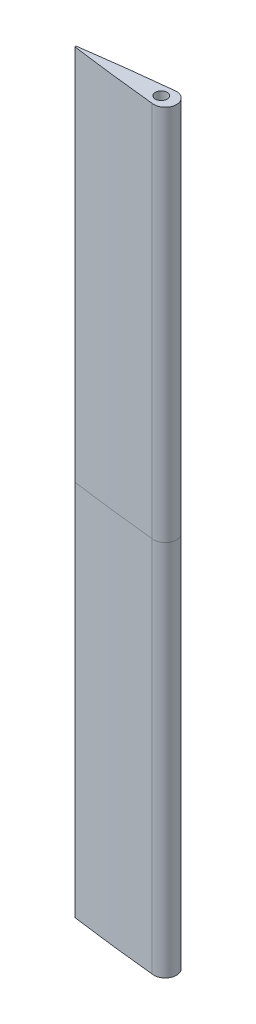
ISO-10303-21;
HEADER;
FILE_DESCRIPTION(('STEP AP214'),'2;1');
FILE_NAME('part.step','',(''),(''),'','','');
FILE_SCHEMA(('AUTOMOTIVE_DESIGN { 1 0 10303 214 1 1 1 1 }'));
ENDSEC;
DATA;
#1=APPLICATION_CONTEXT('core data for automotive mechanical design processes');
#2=APPLICATION_PROTOCOL_DEFINITION('international standard','automotive_design',2000,#1);
#3=PRODUCT_CONTEXT('',#1,'mechanical');
#4=PRODUCT('Part','Part','',(#3));
#5=PRODUCT_RELATED_PRODUCT_CATEGORY('part','',(#4));
#6=PRODUCT_DEFINITION_FORMATION('','',#4);
#7=PRODUCT_DEFINITION_CONTEXT('part definition',#1,'design');
#8=PRODUCT_DEFINITION('design','',#6,#7);
#9=PRODUCT_DEFINITION_SHAPE('','',#8);
#10=(LENGTH_UNIT() NAMED_UNIT(*) SI_UNIT(.MILLI.,.METRE.));
#11=(NAMED_UNIT(*) PLANE_ANGLE_UNIT() SI_UNIT($,.RADIAN.));
#12=(NAMED_UNIT(*) SI_UNIT($,.STERADIAN.) SOLID_ANGLE_UNIT());
#13=UNCERTAINTY_MEASURE_WITH_UNIT(LENGTH_MEASURE(1.E-05),#10,'distance_accuracy_value','');
#14=(GEOMETRIC_REPRESENTATION_CONTEXT(3) GLOBAL_UNCERTAINTY_ASSIGNED_CONTEXT((#13)) GLOBAL_UNIT_ASSIGNED_CONTEXT((#10,
#11,#12)) REPRESENTATION_CONTEXT('',''));
#15=CARTESIAN_POINT('',(0.,0.,0.));
#16=DIRECTION('',(0.,0.,1.));
#17=DIRECTION('',(1.,0.,0.));
#18=AXIS2_PLACEMENT_3D('',#15,#16,#17);
#19=CARTESIAN_POINT('',(0.,190.,0.));
#20=DIRECTION('',(0.,1.,0.));
#21=DIRECTION('',(0.,0.,1.));
#22=AXIS2_PLACEMENT_3D('',#19,#20,#21);
#23=PLANE('',#22);
#24=DIRECTION('',(7.0098962931437E-07,0.,0.999999999999754));
#25=VECTOR('',#24,1.);
#26=CARTESIAN_POINT('',(-9.09780797356294,190.,-0.883777471889075));
#27=LINE('',#26,#25);
#28=CARTESIAN_POINT('',(-9.09780797127802,190.,-0.883777472212133));
#29=VERTEX_POINT('',#28);
#30=CARTESIAN_POINT('',(-9.09780754001095,190.,-0.265291879737339));
#31=VERTEX_POINT('',#30);
#32=EDGE_CURVE('E104',#29,#31,#27,.T.);
#33=ORIENTED_EDGE('',*,*,#32,.T.);
#34=CARTESIAN_POINT('',(961636.924313305,190.,-273912.438107476));
#35=CARTESIAN_POINT('',(-964958.65464866,190.,263071.185208628));
#36=CARTESIAN_POINT('',(967448.922188831,190.,-252605.936221571));
#37=B_SPLINE_CURVE_WITH_KNOTS('',2,(#34,#35,#36),.UNSPECIFIED.,.F.,.F.,(3,3),(0.,1.),.UNSPECIFIED.);
#38=CARTESIAN_POINT('',(35.0713490991894,190.,4.93965416649326));
#39=VERTEX_POINT('',#38);
#40=EDGE_CURVE('E113',#31,#39,#37,.T.);
#41=ORIENTED_EDGE('',*,*,#40,.T.);
#42=CARTESIAN_POINT('',(36.0713490991894,190.,-0.686445363234236));
#43=DIRECTION('',(0.,1.,0.));
#44=DIRECTION('',(0.,0.,1.));
#45=AXIS2_PLACEMENT_3D('',#42,#43,#44);
#46=CIRCLE('',#45,5.71428);
#47=CARTESIAN_POINT('',(35.0713490991895,190.,-6.31254489296174));
#48=VERTEX_POINT('',#47);
#49=EDGE_CURVE('E118',#39,#48,#46,.T.);
#50=ORIENTED_EDGE('',*,*,#49,.T.);
#51=CARTESIAN_POINT('',(968735.08533982,190.,247625.104847928));
#52=CARTESIAN_POINT('',(-966297.159558536,190.,-258114.314813913));
#53=CARTESIAN_POINT('',(963027.584456695,190.,268979.776906749));
#54=B_SPLINE_CURVE_WITH_KNOTS('',2,(#51,#52,#53),.UNSPECIFIED.,.F.,.F.,(3,3),(0.,1.),.UNSPECIFIED.);
#55=EDGE_CURVE('E122',#48,#29,#54,.T.);
#56=ORIENTED_EDGE('',*,*,#55,.T.);
#57=EDGE_LOOP('',(#33,#41,#50,#56));
#58=FACE_BOUND('',#57,.T.);
#59=CARTESIAN_POINT('',(34.0713490991894,190.,-0.686445363234236));
#60=DIRECTION('',(0.,1.,0.));
#61=DIRECTION('',(0.,0.,1.));
#62=AXIS2_PLACEMENT_3D('',#59,#60,#61);
#63=CIRCLE('',#62,0.999999999999998);
#64=CARTESIAN_POINT('',(34.0713490991894,190.,0.313554636765762));
#65=VERTEX_POINT('',#64);
#66=EDGE_CURVE('E117',#65,#65,#63,.T.);
#67=ORIENTED_EDGE('',*,*,#66,.F.);
#68=EDGE_LOOP('',(#67));
#69=FACE_BOUND('',#68,.T.);
#70=CARTESIAN_POINT('',(10.364351517666,190.,-0.686445363234236));
#71=DIRECTION('',(0.,1.,0.));
#72=DIRECTION('',(0.,0.,1.));
#73=AXIS2_PLACEMENT_3D('',#70,#71,#72);
#74=CIRCLE('',#73,1.);
#75=CARTESIAN_POINT('',(10.364351517666,190.,0.313554636765766));
#76=VERTEX_POINT('',#75);
#77=EDGE_CURVE('E130',#76,#76,#74,.T.);
#78=ORIENTED_EDGE('',*,*,#77,.F.);
#79=EDGE_LOOP('',(#78));
#80=FACE_BOUND('',#79,.T.);
#81=ADVANCED_FACE('F55',(#58,#69,#80),#23,.T.);
#82=CARTESIAN_POINT('',(10.364351517666,37.5,-0.686445363234236));
#83=DIRECTION('',(0.,1.,0.));
#84=DIRECTION('',(0.,0.,1.));
#85=AXIS2_PLACEMENT_3D('',#82,#83,#84);
#86=PLANE('',#85);
#87=CARTESIAN_POINT('',(10.364351517666,37.5,-0.686445363234236));
#88=DIRECTION('',(0.,1.,0.));
#89=DIRECTION('',(0.,0.,1.));
#90=AXIS2_PLACEMENT_3D('',#87,#88,#89);
#91=CIRCLE('',#90,1.);
#92=CARTESIAN_POINT('',(10.364351517666,37.5,0.313554636765766));
#93=VERTEX_POINT('',#92);
#94=EDGE_CURVE('E13',#93,#93,#91,.T.);
#95=ORIENTED_EDGE('',*,*,#94,.T.);
#96=EDGE_LOOP('',(#95));
#97=FACE_BOUND('',#96,.T.);
#98=ADVANCED_FACE('F151',(#97),#86,.T.);
#99=CARTESIAN_POINT('',(10.364351517666,342.5,-0.686445363234236));
#100=DIRECTION('',(0.,-1.,0.));
#101=DIRECTION('',(0.,0.,-1.));
#102=AXIS2_PLACEMENT_3D('',#99,#100,#101);
#103=CYLINDRICAL_SURFACE('',#102,1.);
#104=ORIENTED_EDGE('',*,*,#94,.F.);
#105=EDGE_LOOP('',(#104));
#106=FACE_BOUND('',#105,.T.);
#107=ORIENTED_EDGE('',*,*,#77,.T.);
#108=EDGE_LOOP('',(#107));
#109=FACE_BOUND('',#108,.T.);
#110=ADVANCED_FACE('F153',(#106,#109),#103,.F.);
#111=CARTESIAN_POINT('',(34.0713490991894,37.5,-0.686445363234236));
#112=DIRECTION('',(0.,1.,0.));
#113=DIRECTION('',(0.,0.,1.));
#114=AXIS2_PLACEMENT_3D('',#111,#112,#113);
#115=PLANE('',#114);
#116=CARTESIAN_POINT('',(34.0713490991894,37.5,-0.686445363234236));
#117=DIRECTION('',(0.,1.,0.));
#118=DIRECTION('',(0.,0.,1.));
#119=AXIS2_PLACEMENT_3D('',#116,#117,#118);
#120=CIRCLE('',#119,0.999999999999998);
#121=CARTESIAN_POINT('',(34.0713490991894,37.5,0.313554636765762));
#122=VERTEX_POINT('',#121);
#123=EDGE_CURVE('E66',#122,#122,#120,.T.);
#124=ORIENTED_EDGE('',*,*,#123,.T.);
#125=EDGE_LOOP('',(#124));
#126=FACE_BOUND('',#125,.T.);
#127=ADVANCED_FACE('F160',(#126),#115,.T.);
#128=CARTESIAN_POINT('',(34.0713490991894,342.5,-0.686445363234236));
#129=DIRECTION('',(0.,-1.,0.));
#130=DIRECTION('',(0.,0.,-1.));
#131=AXIS2_PLACEMENT_3D('',#128,#129,#130);
#132=CYLINDRICAL_SURFACE('',#131,0.999999999999998);
#133=ORIENTED_EDGE('',*,*,#123,.F.);
#134=EDGE_LOOP('',(#133));
#135=FACE_BOUND('',#134,.T.);
#136=ORIENTED_EDGE('',*,*,#66,.T.);
#137=EDGE_LOOP('',(#136));
#138=FACE_BOUND('',#137,.T.);
#139=ADVANCED_FACE('F142',(#135,#138),#132,.F.);
#140=CARTESIAN_POINT('',(961636.924313305,380.,-273912.438107476));
#141=CARTESIAN_POINT('',(-964958.65464866,380.,263071.185208628));
#142=CARTESIAN_POINT('',(967448.922188831,380.,-252605.936221571));
#143=B_SPLINE_CURVE_WITH_KNOTS('',2,(#140,#141,#142),.UNSPECIFIED.,.F.,.F.,(3,3),(0.,1.),.UNSPECIFIED.);
#144=DIRECTION('',(0.,-1.,0.));
#145=VECTOR('',#144,1.);
#146=SURFACE_OF_LINEAR_EXTRUSION('',#143,#145);
#147=ORIENTED_EDGE('',*,*,#40,.F.);
#148=DIRECTION('',(0.,-1.,0.));
#149=VECTOR('',#148,1.);
#150=CARTESIAN_POINT('',(-9.09780754001095,380.,-0.265291879737339));
#151=LINE('',#150,#149);
#152=CARTESIAN_POINT('',(-9.09780754001095,0.,-0.265291879737339));
#153=VERTEX_POINT('',#152);
#154=EDGE_CURVE('E101',#31,#153,#151,.T.);
#155=ORIENTED_EDGE('',*,*,#154,.T.);
#156=CARTESIAN_POINT('',(961636.924313305,0.,-273912.438107476));
#157=CARTESIAN_POINT('',(-964958.65464866,0.,263071.185208628));
#158=CARTESIAN_POINT('',(967448.922188831,0.,-252605.936221571));
#159=B_SPLINE_CURVE_WITH_KNOTS('',2,(#156,#157,#158),.UNSPECIFIED.,.F.,.F.,(3,3),(0.,1.),.UNSPECIFIED.);
#160=CARTESIAN_POINT('',(35.0713490991894,0.,4.93965416649326));
#161=VERTEX_POINT('',#160);
#162=EDGE_CURVE('E193',#153,#161,#159,.T.);
#163=ORIENTED_EDGE('',*,*,#162,.T.);
#164=DIRECTION('',(0.,-1.,0.));
#165=VECTOR('',#164,1.);
#166=CARTESIAN_POINT('',(35.0713490991894,380.,4.93965416649326));
#167=LINE('',#166,#165);
#168=EDGE_CURVE('E74',#39,#161,#167,.T.);
#169=ORIENTED_EDGE('',*,*,#168,.F.);
#170=EDGE_LOOP('',(#147,#155,#163,#169));
#171=FACE_BOUND('',#170,.T.);
#172=ADVANCED_FACE('F114',(#171),#146,.F.);
#173=CARTESIAN_POINT('',(36.0713490991894,380.,-0.686445363234236));
#174=DIRECTION('',(0.,-1.,0.));
#175=DIRECTION('',(0.,0.,-1.));
#176=AXIS2_PLACEMENT_3D('',#173,#174,#175);
#177=CYLINDRICAL_SURFACE('',#176,5.71428);
#178=ORIENTED_EDGE('',*,*,#49,.F.);
#179=ORIENTED_EDGE('',*,*,#168,.T.);
#180=CARTESIAN_POINT('',(36.0713490991894,0.,-0.686445363234236));
#181=DIRECTION('',(0.,1.,0.));
#182=DIRECTION('',(0.,0.,1.));
#183=AXIS2_PLACEMENT_3D('',#180,#181,#182);
#184=CIRCLE('',#183,5.71428);
#185=CARTESIAN_POINT('',(35.0713490991895,0.,-6.31254489296174));
#186=VERTEX_POINT('',#185);
#187=EDGE_CURVE('E191',#161,#186,#184,.T.);
#188=ORIENTED_EDGE('',*,*,#187,.T.);
#189=DIRECTION('',(0.,-1.,0.));
#190=VECTOR('',#189,1.);
#191=CARTESIAN_POINT('',(35.0713490991895,380.,-6.31254489296174));
#192=LINE('',#191,#190);
#193=EDGE_CURVE('E82',#48,#186,#192,.T.);
#194=ORIENTED_EDGE('',*,*,#193,.F.);
#195=EDGE_LOOP('',(#178,#179,#188,#194));
#196=FACE_BOUND('',#195,.T.);
#197=ADVANCED_FACE('F141',(#196),#177,.T.);
#198=CARTESIAN_POINT('',(968735.08533982,380.,247625.104847928));
#199=CARTESIAN_POINT('',(-966297.159558536,380.,-258114.314813913));
#200=CARTESIAN_POINT('',(963027.584456695,380.,268979.776906749));
#201=B_SPLINE_CURVE_WITH_KNOTS('',2,(#198,#199,#200),.UNSPECIFIED.,.F.,.F.,(3,3),(0.,1.),.UNSPECIFIED.);
#202=DIRECTION('',(0.,-1.,0.));
#203=VECTOR('',#202,1.);
#204=SURFACE_OF_LINEAR_EXTRUSION('',#201,#203);
#205=ORIENTED_EDGE('',*,*,#55,.F.);
#206=ORIENTED_EDGE('',*,*,#193,.T.);
#207=CARTESIAN_POINT('',(968735.08533982,0.,247625.104847928));
#208=CARTESIAN_POINT('',(-966297.159558536,0.,-258114.314813913));
#209=CARTESIAN_POINT('',(963027.584456695,0.,268979.776906749));
#210=B_SPLINE_CURVE_WITH_KNOTS('',2,(#207,#208,#209),.UNSPECIFIED.,.F.,.F.,(3,3),(0.,1.),.UNSPECIFIED.);
#211=CARTESIAN_POINT('',(-9.09780797127802,0.,-0.883777472212133));
#212=VERTEX_POINT('',#211);
#213=EDGE_CURVE('E189',#186,#212,#210,.T.);
#214=ORIENTED_EDGE('',*,*,#213,.T.);
#215=DIRECTION('',(0.,-1.,0.));
#216=VECTOR('',#215,1.);
#217=CARTESIAN_POINT('',(-9.09780797127802,380.,-0.883777472212133));
#218=LINE('',#217,#216);
#219=EDGE_CURVE('E110',#29,#212,#218,.T.);
#220=ORIENTED_EDGE('',*,*,#219,.F.);
#221=EDGE_LOOP('',(#205,#206,#214,#220));
#222=FACE_BOUND('',#221,.T.);
#223=ADVANCED_FACE('F144',(#222),#204,.F.);
#224=CARTESIAN_POINT('',(-9.09780797356294,380.,-0.883777471889075));
#225=DIRECTION('',(0.999999999999754,0.,-7.0098962931437E-07));
#226=DIRECTION('',(-7.0098962931437E-07,0.,-0.999999999999754));
#227=AXIS2_PLACEMENT_3D('',#224,#225,#226);
#228=PLANE('',#227);
#229=ORIENTED_EDGE('',*,*,#32,.F.);
#230=ORIENTED_EDGE('',*,*,#219,.T.);
#231=DIRECTION('',(7.0098962931437E-07,0.,0.999999999999754));
#232=VECTOR('',#231,1.);
#233=CARTESIAN_POINT('',(-9.09780797356294,0.,-0.883777471889075));
#234=LINE('',#233,#232);
#235=EDGE_CURVE('E106',#212,#153,#234,.T.);
#236=ORIENTED_EDGE('',*,*,#235,.T.);
#237=ORIENTED_EDGE('',*,*,#154,.F.);
#238=EDGE_LOOP('',(#229,#230,#236,#237));
#239=FACE_BOUND('',#238,.T.);
#240=ADVANCED_FACE('F57',(#239),#228,.F.);
#241=CARTESIAN_POINT('',(-207.865698795928,0.,-94.0009779478714));
#242=DIRECTION('',(0.,-1.,0.));
#243=DIRECTION('',(0.,0.,-1.));
#244=AXIS2_PLACEMENT_3D('',#241,#242,#243);
#245=PLANE('',#244);
#246=CARTESIAN_POINT('',(34.0713490991894,0.,-0.686445363234236));
#247=DIRECTION('',(0.,1.,0.));
#248=DIRECTION('',(0.,0.,1.));
#249=AXIS2_PLACEMENT_3D('',#246,#247,#248);
#250=CIRCLE('',#249,2.99999999999999);
#251=CARTESIAN_POINT('',(34.0713490991894,0.,2.31355463676576));
#252=VERTEX_POINT('',#251);
#253=EDGE_CURVE('E206',#252,#252,#250,.T.);
#254=ORIENTED_EDGE('',*,*,#253,.T.);
#255=EDGE_LOOP('',(#254));
#256=FACE_BOUND('',#255,.T.);
#257=ORIENTED_EDGE('',*,*,#162,.F.);
#258=ORIENTED_EDGE('',*,*,#235,.F.);
#259=ORIENTED_EDGE('',*,*,#213,.F.);
#260=ORIENTED_EDGE('',*,*,#187,.F.);
#261=EDGE_LOOP('',(#257,#258,#259,#260));
#262=FACE_BOUND('',#261,.T.);
#263=ADVANCED_FACE('F150',(#256,#262),#245,.T.);
#264=CARTESIAN_POINT('',(34.0713490991894,5.,-0.686445363234236));
#265=DIRECTION('',(0.,-1.,0.));
#266=DIRECTION('',(0.,0.,-1.));
#267=AXIS2_PLACEMENT_3D('',#264,#265,#266);
#268=CYLINDRICAL_SURFACE('',#267,2.99999999999999);
#269=CARTESIAN_POINT('',(34.0713490991894,5.,-0.686445363234236));
#270=DIRECTION('',(0.,1.,0.));
#271=DIRECTION('',(0.,0.,1.));
#272=AXIS2_PLACEMENT_3D('',#269,#270,#271);
#273=CIRCLE('',#272,2.99999999999999);
#274=CARTESIAN_POINT('',(34.0713490991894,5.,2.31355463676576));
#275=VERTEX_POINT('',#274);
#276=EDGE_CURVE('E205',#275,#275,#273,.T.);
#277=ORIENTED_EDGE('',*,*,#276,.T.);
#278=EDGE_LOOP('',(#277));
#279=FACE_BOUND('',#278,.T.);
#280=ORIENTED_EDGE('',*,*,#253,.F.);
#281=EDGE_LOOP('',(#280));
#282=FACE_BOUND('',#281,.T.);
#283=ADVANCED_FACE('F215',(#279,#282),#268,.F.);
#284=CARTESIAN_POINT('',(34.0713490991894,5.,-0.686445363234236));
#285=DIRECTION('',(0.,-1.,0.));
#286=DIRECTION('',(0.,0.,1.));
#287=AXIS2_PLACEMENT_3D('',#284,#285,#286);
#288=PLANE('',#287);
#289=ORIENTED_EDGE('',*,*,#276,.F.);
#290=EDGE_LOOP('',(#289));
#291=FACE_BOUND('',#290,.T.);
#292=ADVANCED_FACE('F164',(#291),#288,.T.);
#293=CLOSED_SHELL('',(#81,#98,#110,#127,#139,#172,#197,#223,#240,#263,#283,#292));
#294=MANIFOLD_SOLID_BREP('B2',#293);
#295=CARTESIAN_POINT('',(0.,190.,0.));
#296=DIRECTION('',(0.,1.,0.));
#297=DIRECTION('',(0.,0.,1.));
#298=AXIS2_PLACEMENT_3D('',#295,#296,#297);
#299=PLANE('',#298);
#300=CARTESIAN_POINT('',(10.364351517666,190.,-0.686445363234236));
#301=DIRECTION('',(0.,1.,0.));
#302=DIRECTION('',(0.,0.,1.));
#303=AXIS2_PLACEMENT_3D('',#300,#301,#302);
#304=CIRCLE('',#303,1.);
#305=CARTESIAN_POINT('',(10.364351517666,190.,0.313554636765766));
#306=VERTEX_POINT('',#305);
#307=EDGE_CURVE('E53',#306,#306,#304,.T.);
#308=ORIENTED_EDGE('',*,*,#307,.T.);
#309=EDGE_LOOP('',(#308));
#310=FACE_BOUND('',#309,.T.);
#311=CARTESIAN_POINT('',(34.0713490991894,190.,-0.686445363234236));
#312=DIRECTION('',(0.,1.,0.));
#313=DIRECTION('',(0.,0.,1.));
#314=AXIS2_PLACEMENT_3D('',#311,#312,#313);
#315=CIRCLE('',#314,0.999999999999998);
#316=CARTESIAN_POINT('',(34.0713490991894,190.,0.313554636765762));
#317=VERTEX_POINT('',#316);
#318=EDGE_CURVE('E311',#317,#317,#315,.T.);
#319=ORIENTED_EDGE('',*,*,#318,.T.);
#320=EDGE_LOOP('',(#319));
#321=FACE_BOUND('',#320,.T.);
#322=DIRECTION('',(7.0098962931437E-07,0.,0.999999999999754));
#323=VECTOR('',#322,1.);
#324=CARTESIAN_POINT('',(-9.09780797356294,190.,-0.883777471889075));
#325=LINE('',#324,#323);
#326=CARTESIAN_POINT('',(-9.09780797127802,190.,-0.883777472212133));
#327=VERTEX_POINT('',#326);
#328=CARTESIAN_POINT('',(-9.09780754001095,190.,-0.265291879737339));
#329=VERTEX_POINT('',#328);
#330=EDGE_CURVE('E365',#327,#329,#325,.T.);
#331=ORIENTED_EDGE('',*,*,#330,.F.);
#332=CARTESIAN_POINT('',(968735.08533982,190.,247625.104847928));
#333=CARTESIAN_POINT('',(-966297.159558536,190.,-258114.314813913));
#334=CARTESIAN_POINT('',(963027.584456695,190.,268979.776906749));
#335=B_SPLINE_CURVE_WITH_KNOTS('',2,(#332,#333,#334),.UNSPECIFIED.,.F.,.F.,(3,3),(0.,1.),.UNSPECIFIED.);
#336=CARTESIAN_POINT('',(35.0713490991895,190.,-6.31254489296174));
#337=VERTEX_POINT('',#336);
#338=EDGE_CURVE('E370',#337,#327,#335,.T.);
#339=ORIENTED_EDGE('',*,*,#338,.F.);
#340=CARTESIAN_POINT('',(36.0713490991894,190.,-0.686445363234236));
#341=DIRECTION('',(0.,1.,0.));
#342=DIRECTION('',(0.,0.,1.));
#343=AXIS2_PLACEMENT_3D('',#340,#341,#342);
#344=CIRCLE('',#343,5.71428);
#345=CARTESIAN_POINT('',(35.0713490991894,190.,4.93965416649326));
#346=VERTEX_POINT('',#345);
#347=EDGE_CURVE('E325',#346,#337,#344,.T.);
#348=ORIENTED_EDGE('',*,*,#347,.F.);
#349=CARTESIAN_POINT('',(961636.924313305,190.,-273912.438107476));
#350=CARTESIAN_POINT('',(-964958.65464866,190.,263071.185208628));
#351=CARTESIAN_POINT('',(967448.922188831,190.,-252605.936221571));
#352=B_SPLINE_CURVE_WITH_KNOTS('',2,(#349,#350,#351),.UNSPECIFIED.,.F.,.F.,(3,3),(0.,1.),.UNSPECIFIED.);
#353=EDGE_CURVE('E303',#329,#346,#352,.T.);
#354=ORIENTED_EDGE('',*,*,#353,.F.);
#355=EDGE_LOOP('',(#331,#339,#348,#354));
#356=FACE_BOUND('',#355,.T.);
#357=ADVANCED_FACE('F300',(#310,#321,#356),#299,.F.);
#358=CARTESIAN_POINT('',(10.364351517666,342.5,-0.686445363234236));
#359=DIRECTION('',(0.,-1.,0.));
#360=DIRECTION('',(0.,0.,-1.));
#361=AXIS2_PLACEMENT_3D('',#358,#359,#360);
#362=CYLINDRICAL_SURFACE('',#361,1.);
#363=ORIENTED_EDGE('',*,*,#307,.F.);
#364=EDGE_LOOP('',(#363));
#365=FACE_BOUND('',#364,.T.);
#366=CARTESIAN_POINT('',(10.364351517666,342.5,-0.686445363234236));
#367=DIRECTION('',(0.,1.,0.));
#368=DIRECTION('',(0.,0.,1.));
#369=AXIS2_PLACEMENT_3D('',#366,#367,#368);
#370=CIRCLE('',#369,1.);
#371=CARTESIAN_POINT('',(10.364351517666,342.5,0.313554636765766));
#372=VERTEX_POINT('',#371);
#373=EDGE_CURVE('E432',#372,#372,#370,.T.);
#374=ORIENTED_EDGE('',*,*,#373,.T.);
#375=EDGE_LOOP('',(#374));
#376=FACE_BOUND('',#375,.T.);
#377=ADVANCED_FACE('F458',(#365,#376),#362,.F.);
#378=CARTESIAN_POINT('',(10.364351517666,342.5,-0.686445363234236));
#379=DIRECTION('',(0.,1.,0.));
#380=DIRECTION('',(0.,0.,1.));
#381=AXIS2_PLACEMENT_3D('',#378,#379,#380);
#382=PLANE('',#381);
#383=ORIENTED_EDGE('',*,*,#373,.F.);
#384=EDGE_LOOP('',(#383));
#385=FACE_BOUND('',#384,.T.);
#386=ADVANCED_FACE('F454',(#385),#382,.F.);
#387=CARTESIAN_POINT('',(34.0713490991894,342.5,-0.686445363234236));
#388=DIRECTION('',(0.,-1.,0.));
#389=DIRECTION('',(0.,0.,-1.));
#390=AXIS2_PLACEMENT_3D('',#387,#388,#389);
#391=CYLINDRICAL_SURFACE('',#390,0.999999999999998);
#392=ORIENTED_EDGE('',*,*,#318,.F.);
#393=EDGE_LOOP('',(#392));
#394=FACE_BOUND('',#393,.T.);
#395=CARTESIAN_POINT('',(34.0713490991894,342.5,-0.686445363234236));
#396=DIRECTION('',(0.,1.,0.));
#397=DIRECTION('',(0.,0.,1.));
#398=AXIS2_PLACEMENT_3D('',#395,#396,#397);
#399=CIRCLE('',#398,0.999999999999998);
#400=CARTESIAN_POINT('',(34.0713490991894,342.5,0.313554636765762));
#401=VERTEX_POINT('',#400);
#402=EDGE_CURVE('E428',#401,#401,#399,.T.);
#403=ORIENTED_EDGE('',*,*,#402,.T.);
#404=EDGE_LOOP('',(#403));
#405=FACE_BOUND('',#404,.T.);
#406=ADVANCED_FACE('F440',(#394,#405),#391,.F.);
#407=CARTESIAN_POINT('',(34.0713490991894,342.5,-0.686445363234236));
#408=DIRECTION('',(0.,1.,0.));
#409=DIRECTION('',(0.,0.,1.));
#410=AXIS2_PLACEMENT_3D('',#407,#408,#409);
#411=PLANE('',#410);
#412=ORIENTED_EDGE('',*,*,#402,.F.);
#413=EDGE_LOOP('',(#412));
#414=FACE_BOUND('',#413,.T.);
#415=ADVANCED_FACE('F442',(#414),#411,.F.);
#416=CARTESIAN_POINT('',(34.0713490991894,375.,-0.686445363234236));
#417=DIRECTION('',(0.,1.,0.));
#418=DIRECTION('',(0.,0.,1.));
#419=AXIS2_PLACEMENT_3D('',#416,#417,#418);
#420=PLANE('',#419);
#421=CARTESIAN_POINT('',(34.0713490991894,375.,-0.686445363234236));
#422=DIRECTION('',(0.,1.,0.));
#423=DIRECTION('',(0.,0.,1.));
#424=AXIS2_PLACEMENT_3D('',#421,#422,#423);
#425=CIRCLE('',#424,2.99999999999999);
#426=CARTESIAN_POINT('',(34.0713490991894,375.,2.31355463676576));
#427=VERTEX_POINT('',#426);
#428=EDGE_CURVE('E361',#427,#427,#425,.T.);
#429=ORIENTED_EDGE('',*,*,#428,.T.);
#430=EDGE_LOOP('',(#429));
#431=FACE_BOUND('',#430,.T.);
#432=ADVANCED_FACE('F444',(#431),#420,.T.);
#433=CARTESIAN_POINT('',(34.0713490991894,375.,-0.686445363234236));
#434=DIRECTION('',(0.,1.,0.));
#435=DIRECTION('',(0.,0.,1.));
#436=AXIS2_PLACEMENT_3D('',#433,#434,#435);
#437=CYLINDRICAL_SURFACE('',#436,2.99999999999999);
#438=ORIENTED_EDGE('',*,*,#428,.F.);
#439=EDGE_LOOP('',(#438));
#440=FACE_BOUND('',#439,.T.);
#441=CARTESIAN_POINT('',(34.0713490991894,380.,-0.686445363234236));
#442=DIRECTION('',(0.,1.,0.));
#443=DIRECTION('',(0.,0.,1.));
#444=AXIS2_PLACEMENT_3D('',#441,#442,#443);
#445=CIRCLE('',#444,2.99999999999999);
#446=CARTESIAN_POINT('',(34.0713490991894,380.,2.31355463676576));
#447=VERTEX_POINT('',#446);
#448=EDGE_CURVE('E421',#447,#447,#445,.T.);
#449=ORIENTED_EDGE('',*,*,#448,.T.);
#450=EDGE_LOOP('',(#449));
#451=FACE_BOUND('',#450,.T.);
#452=ADVANCED_FACE('F415',(#440,#451),#437,.F.);
#453=CARTESIAN_POINT('',(36.0713490991894,380.,-0.686445363234236));
#454=DIRECTION('',(0.,-1.,0.));
#455=DIRECTION('',(0.,0.,-1.));
#456=AXIS2_PLACEMENT_3D('',#453,#454,#455);
#457=CYLINDRICAL_SURFACE('',#456,5.71428);
#458=DIRECTION('',(0.,-1.,0.));
#459=VECTOR('',#458,1.);
#460=CARTESIAN_POINT('',(35.0713490991894,380.,4.93965416649326));
#461=LINE('',#460,#459);
#462=CARTESIAN_POINT('',(35.0713490991894,380.,4.93965416649326));
#463=VERTEX_POINT('',#462);
#464=EDGE_CURVE('E346',#463,#346,#461,.T.);
#465=ORIENTED_EDGE('',*,*,#464,.T.);
#466=ORIENTED_EDGE('',*,*,#347,.T.);
#467=DIRECTION('',(0.,-1.,0.));
#468=VECTOR('',#467,1.);
#469=CARTESIAN_POINT('',(35.0713490991895,380.,-6.31254489296174));
#470=LINE('',#469,#468);
#471=CARTESIAN_POINT('',(35.0713490991895,380.,-6.31254489296174));
#472=VERTEX_POINT('',#471);
#473=EDGE_CURVE('E348',#472,#337,#470,.T.);
#474=ORIENTED_EDGE('',*,*,#473,.F.);
#475=CARTESIAN_POINT('',(36.0713490991894,380.,-0.686445363234236));
#476=DIRECTION('',(0.,1.,0.));
#477=DIRECTION('',(0.,0.,1.));
#478=AXIS2_PLACEMENT_3D('',#475,#476,#477);
#479=CIRCLE('',#478,5.71428);
#480=EDGE_CURVE('E343',#463,#472,#479,.T.);
#481=ORIENTED_EDGE('',*,*,#480,.F.);
#482=EDGE_LOOP('',(#465,#466,#474,#481));
#483=FACE_BOUND('',#482,.T.);
#484=ADVANCED_FACE('F345',(#483),#457,.T.);
#485=CARTESIAN_POINT('',(-207.865698795928,380.,-94.0009779478714));
#486=DIRECTION('',(0.,-1.,0.));
#487=DIRECTION('',(0.,0.,-1.));
#488=AXIS2_PLACEMENT_3D('',#485,#486,#487);
#489=PLANE('',#488);
#490=ORIENTED_EDGE('',*,*,#448,.F.);
#491=EDGE_LOOP('',(#490));
#492=FACE_BOUND('',#491,.T.);
#493=CARTESIAN_POINT('',(961636.924313305,380.,-273912.438107476));
#494=CARTESIAN_POINT('',(-964958.65464866,380.,263071.185208628));
#495=CARTESIAN_POINT('',(967448.922188831,380.,-252605.936221571));
#496=B_SPLINE_CURVE_WITH_KNOTS('',2,(#493,#494,#495),.UNSPECIFIED.,.F.,.F.,(3,3),(0.,1.),.UNSPECIFIED.);
#497=CARTESIAN_POINT('',(-9.09780754001095,380.,-0.265291879737339));
#498=VERTEX_POINT('',#497);
#499=EDGE_CURVE('E353',#498,#463,#496,.T.);
#500=ORIENTED_EDGE('',*,*,#499,.T.);
#501=ORIENTED_EDGE('',*,*,#480,.T.);
#502=CARTESIAN_POINT('',(968735.08533982,380.,247625.104847928));
#503=CARTESIAN_POINT('',(-966297.159558536,380.,-258114.314813913));
#504=CARTESIAN_POINT('',(963027.584456695,380.,268979.776906749));
#505=B_SPLINE_CURVE_WITH_KNOTS('',2,(#502,#503,#504),.UNSPECIFIED.,.F.,.F.,(3,3),(0.,1.),.UNSPECIFIED.);
#506=CARTESIAN_POINT('',(-9.09780797127802,380.,-0.883777472212133));
#507=VERTEX_POINT('',#506);
#508=EDGE_CURVE('E352',#472,#507,#505,.T.);
#509=ORIENTED_EDGE('',*,*,#508,.T.);
#510=DIRECTION('',(7.0098962931437E-07,0.,0.999999999999754));
#511=VECTOR('',#510,1.);
#512=CARTESIAN_POINT('',(-9.09780797356294,380.,-0.883777471889075));
#513=LINE('',#512,#511);
#514=EDGE_CURVE('E358',#507,#498,#513,.T.);
#515=ORIENTED_EDGE('',*,*,#514,.T.);
#516=EDGE_LOOP('',(#500,#501,#509,#515));
#517=FACE_BOUND('',#516,.T.);
#518=ADVANCED_FACE('F356',(#492,#517),#489,.F.);
#519=DIRECTION('',(0.,-1.,0.));
#520=VECTOR('',#519,1.);
#521=SURFACE_OF_LINEAR_EXTRUSION('',#496,#520);
#522=DIRECTION('',(0.,-1.,0.));
#523=VECTOR('',#522,1.);
#524=CARTESIAN_POINT('',(-9.09780754001095,380.,-0.265291879737339));
#525=LINE('',#524,#523);
#526=EDGE_CURVE('E396',#498,#329,#525,.T.);
#527=ORIENTED_EDGE('',*,*,#526,.T.);
#528=ORIENTED_EDGE('',*,*,#353,.T.);
#529=ORIENTED_EDGE('',*,*,#464,.F.);
#530=ORIENTED_EDGE('',*,*,#499,.F.);
#531=EDGE_LOOP('',(#527,#528,#529,#530));
#532=FACE_BOUND('',#531,.T.);
#533=ADVANCED_FACE('F363',(#532),#521,.F.);
#534=DIRECTION('',(0.,-1.,0.));
#535=VECTOR('',#534,1.);
#536=SURFACE_OF_LINEAR_EXTRUSION('',#505,#535);
#537=ORIENTED_EDGE('',*,*,#473,.T.);
#538=ORIENTED_EDGE('',*,*,#338,.T.);
#539=DIRECTION('',(0.,-1.,0.));
#540=VECTOR('',#539,1.);
#541=CARTESIAN_POINT('',(-9.09780797127802,380.,-0.883777472212133));
#542=LINE('',#541,#540);
#543=EDGE_CURVE('E372',#507,#327,#542,.T.);
#544=ORIENTED_EDGE('',*,*,#543,.F.);
#545=ORIENTED_EDGE('',*,*,#508,.F.);
#546=EDGE_LOOP('',(#537,#538,#544,#545));
#547=FACE_BOUND('',#546,.T.);
#548=ADVANCED_FACE('F390',(#547),#536,.F.);
#549=CARTESIAN_POINT('',(-9.09780797356294,380.,-0.883777471889075));
#550=DIRECTION('',(0.999999999999754,0.,-7.0098962931437E-07));
#551=DIRECTION('',(-7.0098962931437E-07,0.,-0.999999999999754));
#552=AXIS2_PLACEMENT_3D('',#549,#550,#551);
#553=PLANE('',#552);
#554=ORIENTED_EDGE('',*,*,#543,.T.);
#555=ORIENTED_EDGE('',*,*,#330,.T.);
#556=ORIENTED_EDGE('',*,*,#526,.F.);
#557=ORIENTED_EDGE('',*,*,#514,.F.);
#558=EDGE_LOOP('',(#554,#555,#556,#557));
#559=FACE_BOUND('',#558,.T.);
#560=ADVANCED_FACE('F394',(#559),#553,.F.);
#561=CLOSED_SHELL('',(#357,#377,#386,#406,#415,#432,#452,#484,#518,#533,#548,#560));
#562=MANIFOLD_SOLID_BREP('B7',#561);
#563=ADVANCED_BREP_SHAPE_REPRESENTATION('',(#18,#294,#562),#14);
#564=SHAPE_DEFINITION_REPRESENTATION(#9,#563);
ENDSEC;
END-ISO-10303-21;
